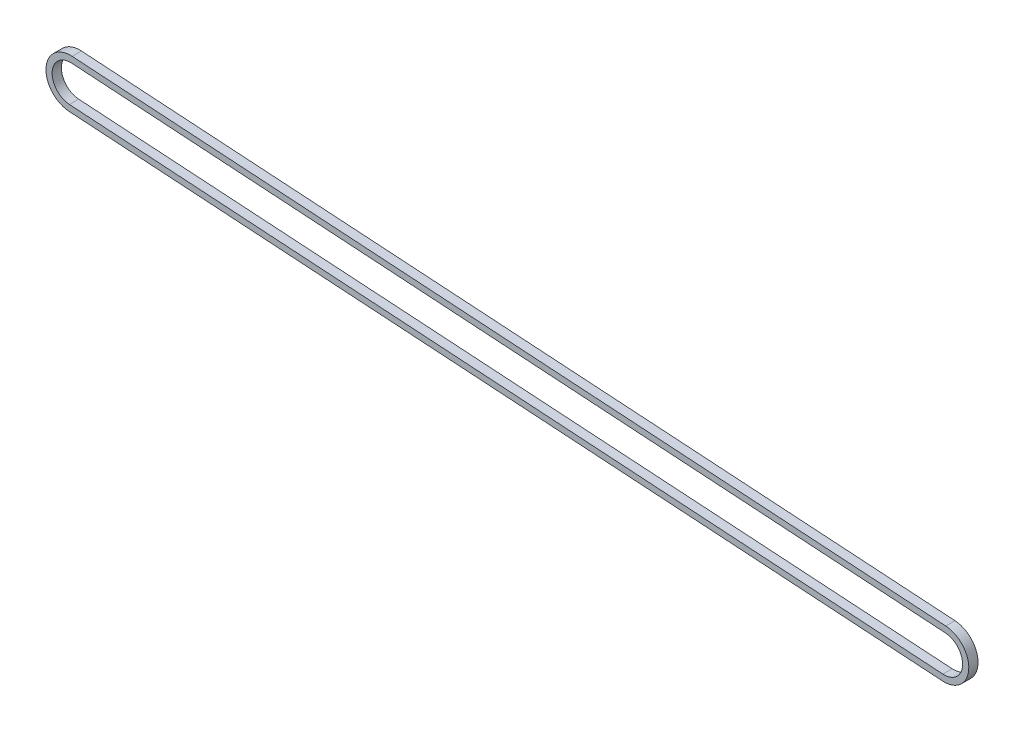
ISO-10303-21;
HEADER;
FILE_DESCRIPTION(('STEP AP214'),'2;1');
FILE_NAME('part.step','',(''),(''),'','','');
FILE_SCHEMA(('AUTOMOTIVE_DESIGN { 1 0 10303 214 1 1 1 1 }'));
ENDSEC;
DATA;
#1=APPLICATION_CONTEXT('core data for automotive mechanical design processes');
#2=APPLICATION_PROTOCOL_DEFINITION('international standard','automotive_design',2000,#1);
#3=PRODUCT_CONTEXT('',#1,'mechanical');
#4=PRODUCT('Part','Part','',(#3));
#5=PRODUCT_RELATED_PRODUCT_CATEGORY('part','',(#4));
#6=PRODUCT_DEFINITION_FORMATION('','',#4);
#7=PRODUCT_DEFINITION_CONTEXT('part definition',#1,'design');
#8=PRODUCT_DEFINITION('design','',#6,#7);
#9=PRODUCT_DEFINITION_SHAPE('','',#8);
#10=(LENGTH_UNIT() NAMED_UNIT(*) SI_UNIT(.MILLI.,.METRE.));
#11=(NAMED_UNIT(*) PLANE_ANGLE_UNIT() SI_UNIT($,.RADIAN.));
#12=(NAMED_UNIT(*) SI_UNIT($,.STERADIAN.) SOLID_ANGLE_UNIT());
#13=UNCERTAINTY_MEASURE_WITH_UNIT(LENGTH_MEASURE(1.E-05),#10,'distance_accuracy_value','');
#14=(GEOMETRIC_REPRESENTATION_CONTEXT(3) GLOBAL_UNCERTAINTY_ASSIGNED_CONTEXT((#13)) GLOBAL_UNIT_ASSIGNED_CONTEXT((#10,
#11,#12)) REPRESENTATION_CONTEXT('',''));
#15=CARTESIAN_POINT('',(0.,0.,0.));
#16=DIRECTION('',(0.,0.,1.));
#17=DIRECTION('',(1.,0.,0.));
#18=AXIS2_PLACEMENT_3D('',#15,#16,#17);
#19=CARTESIAN_POINT('',(0.,0.,3.));
#20=DIRECTION('',(0.,0.,-1.));
#21=DIRECTION('',(-1.,0.,0.));
#22=AXIS2_PLACEMENT_3D('',#19,#20,#21);
#23=PLANE('',#22);
#24=CARTESIAN_POINT('',(0.,0.,3.));
#25=DIRECTION('',(0.,0.,-1.));
#26=DIRECTION('',(-1.,0.,0.));
#27=AXIS2_PLACEMENT_3D('',#24,#25,#26);
#28=CIRCLE('',#27,8.);
#29=CARTESIAN_POINT('',(0.517086349920799,7.98327136622109,3.));
#30=VERTEX_POINT('',#29);
#31=CARTESIAN_POINT('',(-0.51708634992087,-7.9832713662211,3.));
#32=VERTEX_POINT('',#31);
#33=EDGE_CURVE('E162',#30,#32,#28,.F.);
#34=ORIENTED_EDGE('',*,*,#33,.T.);
#35=DIRECTION('',(0.997908920777636,-0.0646357937400999,0.));
#36=VECTOR('',#35,1.);
#37=CARTESIAN_POINT('',(-0.5170863499208,-7.9832713662211,3.));
#38=LINE('',#37,#36);
#39=CARTESIAN_POINT('',(282.917521608444,-26.3416811142037,3.));
#40=VERTEX_POINT('',#39);
#41=EDGE_CURVE('E165',#32,#40,#38,.T.);
#42=ORIENTED_EDGE('',*,*,#41,.T.);
#43=CARTESIAN_POINT('',(283.434607958365,-18.3584097479826,3.));
#44=DIRECTION('',(0.,0.,-1.));
#45=DIRECTION('',(-1.,0.,0.));
#46=AXIS2_PLACEMENT_3D('',#43,#44,#45);
#47=CIRCLE('',#46,8.);
#48=CARTESIAN_POINT('',(283.951694308286,-10.3751383817615,3.));
#49=VERTEX_POINT('',#48);
#50=EDGE_CURVE('E168',#40,#49,#47,.F.);
#51=ORIENTED_EDGE('',*,*,#50,.T.);
#52=DIRECTION('',(-0.997908920777636,0.0646357937400999,0.));
#53=VECTOR('',#52,1.);
#54=CARTESIAN_POINT('',(0.517086349920799,7.98327136622109,3.));
#55=LINE('',#54,#53);
#56=EDGE_CURVE('E170',#49,#30,#55,.T.);
#57=ORIENTED_EDGE('',*,*,#56,.T.);
#58=EDGE_LOOP('',(#34,#42,#51,#57));
#59=FACE_BOUND('',#58,.T.);
#60=CARTESIAN_POINT('',(0.,0.,3.));
#61=DIRECTION('',(0.,0.,1.));
#62=DIRECTION('',(-1.,0.,0.));
#63=AXIS2_PLACEMENT_3D('',#60,#61,#62);
#64=CIRCLE('',#63,6.);
#65=CARTESIAN_POINT('',(0.3878147624406,5.98745352466582,3.));
#66=VERTEX_POINT('',#65);
#67=CARTESIAN_POINT('',(-0.3878147624406,-5.98745352466582,3.));
#68=VERTEX_POINT('',#67);
#69=EDGE_CURVE('E126',#66,#68,#64,.T.);
#70=ORIENTED_EDGE('',*,*,#69,.F.);
#71=DIRECTION('',(-0.997908920777637,0.0646357937401,0.));
#72=VECTOR('',#71,1.);
#73=CARTESIAN_POINT('',(0.3878147624406,5.98745352466582,3.));
#74=LINE('',#73,#72);
#75=CARTESIAN_POINT('',(283.822422720806,-12.3709562233168,3.));
#76=VERTEX_POINT('',#75);
#77=EDGE_CURVE('E148',#76,#66,#74,.T.);
#78=ORIENTED_EDGE('',*,*,#77,.F.);
#79=CARTESIAN_POINT('',(283.434607958365,-18.3584097479826,3.));
#80=DIRECTION('',(0.,0.,1.));
#81=DIRECTION('',(-1.,0.,0.));
#82=AXIS2_PLACEMENT_3D('',#79,#80,#81);
#83=CIRCLE('',#82,6.);
#84=CARTESIAN_POINT('',(283.046793195925,-24.3458632726484,3.));
#85=VERTEX_POINT('',#84);
#86=EDGE_CURVE('E146',#85,#76,#83,.T.);
#87=ORIENTED_EDGE('',*,*,#86,.F.);
#88=DIRECTION('',(0.997908920777637,-0.0646357937401,0.));
#89=VECTOR('',#88,1.);
#90=CARTESIAN_POINT('',(283.046793195925,-24.3458632726484,3.));
#91=LINE('',#90,#89);
#92=EDGE_CURVE('E134',#68,#85,#91,.T.);
#93=ORIENTED_EDGE('',*,*,#92,.F.);
#94=EDGE_LOOP('',(#70,#78,#87,#93));
#95=FACE_BOUND('',#94,.T.);
#96=ADVANCED_FACE('F61',(#59,#95),#23,.F.);
#97=CARTESIAN_POINT('',(0.,0.,0.));
#98=DIRECTION('',(0.,0.,-1.));
#99=DIRECTION('',(-1.,0.,0.));
#100=AXIS2_PLACEMENT_3D('',#97,#98,#99);
#101=PLANE('',#100);
#102=CARTESIAN_POINT('',(0.,0.,0.));
#103=DIRECTION('',(0.,0.,-1.));
#104=DIRECTION('',(-1.,0.,0.));
#105=AXIS2_PLACEMENT_3D('',#102,#103,#104);
#106=CIRCLE('',#105,8.);
#107=CARTESIAN_POINT('',(0.517086349920799,7.98327136622109,0.));
#108=VERTEX_POINT('',#107);
#109=CARTESIAN_POINT('',(-0.51708634992087,-7.9832713662211,0.));
#110=VERTEX_POINT('',#109);
#111=EDGE_CURVE('E142',#108,#110,#106,.F.);
#112=ORIENTED_EDGE('',*,*,#111,.F.);
#113=DIRECTION('',(-0.997908920777636,0.0646357937400999,0.));
#114=VECTOR('',#113,1.);
#115=CARTESIAN_POINT('',(0.517086349920799,7.98327136622109,0.));
#116=LINE('',#115,#114);
#117=CARTESIAN_POINT('',(283.951694308286,-10.3751383817615,0.));
#118=VERTEX_POINT('',#117);
#119=EDGE_CURVE('E166',#118,#108,#116,.T.);
#120=ORIENTED_EDGE('',*,*,#119,.F.);
#121=CARTESIAN_POINT('',(283.434607958365,-18.3584097479826,0.));
#122=DIRECTION('',(0.,0.,-1.));
#123=DIRECTION('',(-1.,0.,0.));
#124=AXIS2_PLACEMENT_3D('',#121,#122,#123);
#125=CIRCLE('',#124,8.);
#126=CARTESIAN_POINT('',(282.917521608444,-26.3416811142037,0.));
#127=VERTEX_POINT('',#126);
#128=EDGE_CURVE('E177',#127,#118,#125,.F.);
#129=ORIENTED_EDGE('',*,*,#128,.F.);
#130=DIRECTION('',(0.997908920777636,-0.0646357937400999,0.));
#131=VECTOR('',#130,1.);
#132=CARTESIAN_POINT('',(-0.5170863499208,-7.9832713662211,0.));
#133=LINE('',#132,#131);
#134=EDGE_CURVE('E175',#110,#127,#133,.T.);
#135=ORIENTED_EDGE('',*,*,#134,.F.);
#136=EDGE_LOOP('',(#112,#120,#129,#135));
#137=FACE_BOUND('',#136,.T.);
#138=DIRECTION('',(-0.997908920777637,0.0646357937401,0.));
#139=VECTOR('',#138,1.);
#140=CARTESIAN_POINT('',(0.3878147624406,5.98745352466582,0.));
#141=LINE('',#140,#139);
#142=CARTESIAN_POINT('',(283.822422720806,-12.3709562233168,0.));
#143=VERTEX_POINT('',#142);
#144=CARTESIAN_POINT('',(0.3878147624406,5.98745352466582,0.));
#145=VERTEX_POINT('',#144);
#146=EDGE_CURVE('E135',#143,#145,#141,.T.);
#147=ORIENTED_EDGE('',*,*,#146,.T.);
#148=CARTESIAN_POINT('',(0.,0.,0.));
#149=DIRECTION('',(0.,0.,1.));
#150=DIRECTION('',(-1.,0.,0.));
#151=AXIS2_PLACEMENT_3D('',#148,#149,#150);
#152=CIRCLE('',#151,6.);
#153=CARTESIAN_POINT('',(-0.3878147624406,-5.98745352466582,0.));
#154=VERTEX_POINT('',#153);
#155=EDGE_CURVE('E84',#145,#154,#152,.T.);
#156=ORIENTED_EDGE('',*,*,#155,.T.);
#157=DIRECTION('',(0.997908920777637,-0.0646357937401,0.));
#158=VECTOR('',#157,1.);
#159=CARTESIAN_POINT('',(283.046793195925,-24.3458632726484,0.));
#160=LINE('',#159,#158);
#161=CARTESIAN_POINT('',(283.046793195925,-24.3458632726484,0.));
#162=VERTEX_POINT('',#161);
#163=EDGE_CURVE('E141',#154,#162,#160,.T.);
#164=ORIENTED_EDGE('',*,*,#163,.T.);
#165=CARTESIAN_POINT('',(283.434607958365,-18.3584097479826,0.));
#166=DIRECTION('',(0.,0.,1.));
#167=DIRECTION('',(-1.,0.,0.));
#168=AXIS2_PLACEMENT_3D('',#165,#166,#167);
#169=CIRCLE('',#168,6.);
#170=EDGE_CURVE('E154',#162,#143,#169,.T.);
#171=ORIENTED_EDGE('',*,*,#170,.T.);
#172=EDGE_LOOP('',(#147,#156,#164,#171));
#173=FACE_BOUND('',#172,.T.);
#174=ADVANCED_FACE('F195',(#137,#173),#101,.T.);
#175=CARTESIAN_POINT('',(0.,0.,3.));
#176=DIRECTION('',(0.,0.,-1.));
#177=DIRECTION('',(-1.,0.,0.));
#178=AXIS2_PLACEMENT_3D('',#175,#176,#177);
#179=CYLINDRICAL_SURFACE('',#178,8.);
#180=ORIENTED_EDGE('',*,*,#111,.T.);
#181=DIRECTION('',(0.,0.,-1.));
#182=VECTOR('',#181,1.);
#183=CARTESIAN_POINT('',(-0.51708634992087,-7.9832713662211,3.));
#184=LINE('',#183,#182);
#185=EDGE_CURVE('E12',#32,#110,#184,.T.);
#186=ORIENTED_EDGE('',*,*,#185,.F.);
#187=ORIENTED_EDGE('',*,*,#33,.F.);
#188=DIRECTION('',(0.,0.,-1.));
#189=VECTOR('',#188,1.);
#190=CARTESIAN_POINT('',(0.517086349920799,7.98327136622109,3.));
#191=LINE('',#190,#189);
#192=EDGE_CURVE('E172',#30,#108,#191,.T.);
#193=ORIENTED_EDGE('',*,*,#192,.T.);
#194=EDGE_LOOP('',(#180,#186,#187,#193));
#195=FACE_BOUND('',#194,.T.);
#196=ADVANCED_FACE('F63',(#195),#179,.T.);
#197=CARTESIAN_POINT('',(-0.5170863499208,-7.9832713662211,3.));
#198=DIRECTION('',(0.0646357937401,0.997908920777637,0.));
#199=DIRECTION('',(-0.997908920777637,0.0646357937401,0.));
#200=AXIS2_PLACEMENT_3D('',#197,#198,#199);
#201=PLANE('',#200);
#202=ORIENTED_EDGE('',*,*,#134,.T.);
#203=DIRECTION('',(0.,0.,-1.));
#204=VECTOR('',#203,1.);
#205=CARTESIAN_POINT('',(282.917521608444,-26.3416811142037,3.));
#206=LINE('',#205,#204);
#207=EDGE_CURVE('E69',#40,#127,#206,.T.);
#208=ORIENTED_EDGE('',*,*,#207,.F.);
#209=ORIENTED_EDGE('',*,*,#41,.F.);
#210=ORIENTED_EDGE('',*,*,#185,.T.);
#211=EDGE_LOOP('',(#202,#208,#209,#210));
#212=FACE_BOUND('',#211,.T.);
#213=ADVANCED_FACE('F205',(#212),#201,.F.);
#214=CARTESIAN_POINT('',(283.434607958365,-18.3584097479826,3.));
#215=DIRECTION('',(0.,0.,-1.));
#216=DIRECTION('',(-1.,0.,0.));
#217=AXIS2_PLACEMENT_3D('',#214,#215,#216);
#218=CYLINDRICAL_SURFACE('',#217,8.);
#219=ORIENTED_EDGE('',*,*,#128,.T.);
#220=DIRECTION('',(0.,0.,-1.));
#221=VECTOR('',#220,1.);
#222=CARTESIAN_POINT('',(283.951694308286,-10.3751383817615,3.));
#223=LINE('',#222,#221);
#224=EDGE_CURVE('E182',#49,#118,#223,.T.);
#225=ORIENTED_EDGE('',*,*,#224,.F.);
#226=ORIENTED_EDGE('',*,*,#50,.F.);
#227=ORIENTED_EDGE('',*,*,#207,.T.);
#228=EDGE_LOOP('',(#219,#225,#226,#227));
#229=FACE_BOUND('',#228,.T.);
#230=ADVANCED_FACE('F189',(#229),#218,.T.);
#231=CARTESIAN_POINT('',(0.517086349920799,7.98327136622109,3.));
#232=DIRECTION('',(-0.0646357937401,-0.997908920777637,0.));
#233=DIRECTION('',(0.997908920777637,-0.0646357937401,0.));
#234=AXIS2_PLACEMENT_3D('',#231,#232,#233);
#235=PLANE('',#234);
#236=ORIENTED_EDGE('',*,*,#119,.T.);
#237=ORIENTED_EDGE('',*,*,#192,.F.);
#238=ORIENTED_EDGE('',*,*,#56,.F.);
#239=ORIENTED_EDGE('',*,*,#224,.T.);
#240=EDGE_LOOP('',(#236,#237,#238,#239));
#241=FACE_BOUND('',#240,.T.);
#242=ADVANCED_FACE('F199',(#241),#235,.F.);
#243=CARTESIAN_POINT('',(0.,0.,3.));
#244=DIRECTION('',(0.,0.,-1.));
#245=DIRECTION('',(-1.,0.,0.));
#246=AXIS2_PLACEMENT_3D('',#243,#244,#245);
#247=CYLINDRICAL_SURFACE('',#246,6.);
#248=ORIENTED_EDGE('',*,*,#155,.F.);
#249=DIRECTION('',(0.,0.,-1.));
#250=VECTOR('',#249,1.);
#251=CARTESIAN_POINT('',(0.3878147624406,5.98745352466582,3.));
#252=LINE('',#251,#250);
#253=EDGE_CURVE('E130',#66,#145,#252,.T.);
#254=ORIENTED_EDGE('',*,*,#253,.F.);
#255=ORIENTED_EDGE('',*,*,#69,.T.);
#256=DIRECTION('',(0.,0.,-1.));
#257=VECTOR('',#256,1.);
#258=CARTESIAN_POINT('',(-0.3878147624406,-5.98745352466582,3.));
#259=LINE('',#258,#257);
#260=EDGE_CURVE('E129',#68,#154,#259,.T.);
#261=ORIENTED_EDGE('',*,*,#260,.T.);
#262=EDGE_LOOP('',(#248,#254,#255,#261));
#263=FACE_BOUND('',#262,.T.);
#264=ADVANCED_FACE('F128',(#263),#247,.F.);
#265=CARTESIAN_POINT('',(283.046793195925,-24.3458632726484,3.));
#266=DIRECTION('',(0.0646357937400999,0.997908920777636,0.));
#267=DIRECTION('',(-0.997908920777637,0.0646357937401,0.));
#268=AXIS2_PLACEMENT_3D('',#265,#266,#267);
#269=PLANE('',#268);
#270=ORIENTED_EDGE('',*,*,#163,.F.);
#271=ORIENTED_EDGE('',*,*,#260,.F.);
#272=ORIENTED_EDGE('',*,*,#92,.T.);
#273=DIRECTION('',(0.,0.,-1.));
#274=VECTOR('',#273,1.);
#275=CARTESIAN_POINT('',(283.046793195925,-24.3458632726484,3.));
#276=LINE('',#275,#274);
#277=EDGE_CURVE('E143',#85,#162,#276,.T.);
#278=ORIENTED_EDGE('',*,*,#277,.T.);
#279=EDGE_LOOP('',(#270,#271,#272,#278));
#280=FACE_BOUND('',#279,.T.);
#281=ADVANCED_FACE('F138',(#280),#269,.T.);
#282=CARTESIAN_POINT('',(283.434607958365,-18.3584097479826,3.));
#283=DIRECTION('',(0.,0.,-1.));
#284=DIRECTION('',(-1.,0.,0.));
#285=AXIS2_PLACEMENT_3D('',#282,#283,#284);
#286=CYLINDRICAL_SURFACE('',#285,6.);
#287=ORIENTED_EDGE('',*,*,#170,.F.);
#288=ORIENTED_EDGE('',*,*,#277,.F.);
#289=ORIENTED_EDGE('',*,*,#86,.T.);
#290=DIRECTION('',(0.,0.,-1.));
#291=VECTOR('',#290,1.);
#292=CARTESIAN_POINT('',(283.822422720806,-12.3709562233168,3.));
#293=LINE('',#292,#291);
#294=EDGE_CURVE('E76',#76,#143,#293,.T.);
#295=ORIENTED_EDGE('',*,*,#294,.T.);
#296=EDGE_LOOP('',(#287,#288,#289,#295));
#297=FACE_BOUND('',#296,.T.);
#298=ADVANCED_FACE('F228',(#297),#286,.F.);
#299=CARTESIAN_POINT('',(0.3878147624406,5.98745352466582,3.));
#300=DIRECTION('',(-0.0646357937400999,-0.997908920777636,0.));
#301=DIRECTION('',(0.997908920777637,-0.0646357937401,0.));
#302=AXIS2_PLACEMENT_3D('',#299,#300,#301);
#303=PLANE('',#302);
#304=ORIENTED_EDGE('',*,*,#146,.F.);
#305=ORIENTED_EDGE('',*,*,#294,.F.);
#306=ORIENTED_EDGE('',*,*,#77,.T.);
#307=ORIENTED_EDGE('',*,*,#253,.T.);
#308=EDGE_LOOP('',(#304,#305,#306,#307));
#309=FACE_BOUND('',#308,.T.);
#310=ADVANCED_FACE('F232',(#309),#303,.T.);
#311=CLOSED_SHELL('',(#96,#174,#196,#213,#230,#242,#264,#281,#298,#310));
#312=MANIFOLD_SOLID_BREP('B2',#311);
#313=ADVANCED_BREP_SHAPE_REPRESENTATION('',(#18,#312),#14);
#314=SHAPE_DEFINITION_REPRESENTATION(#9,#313);
ENDSEC;
END-ISO-10303-21;
